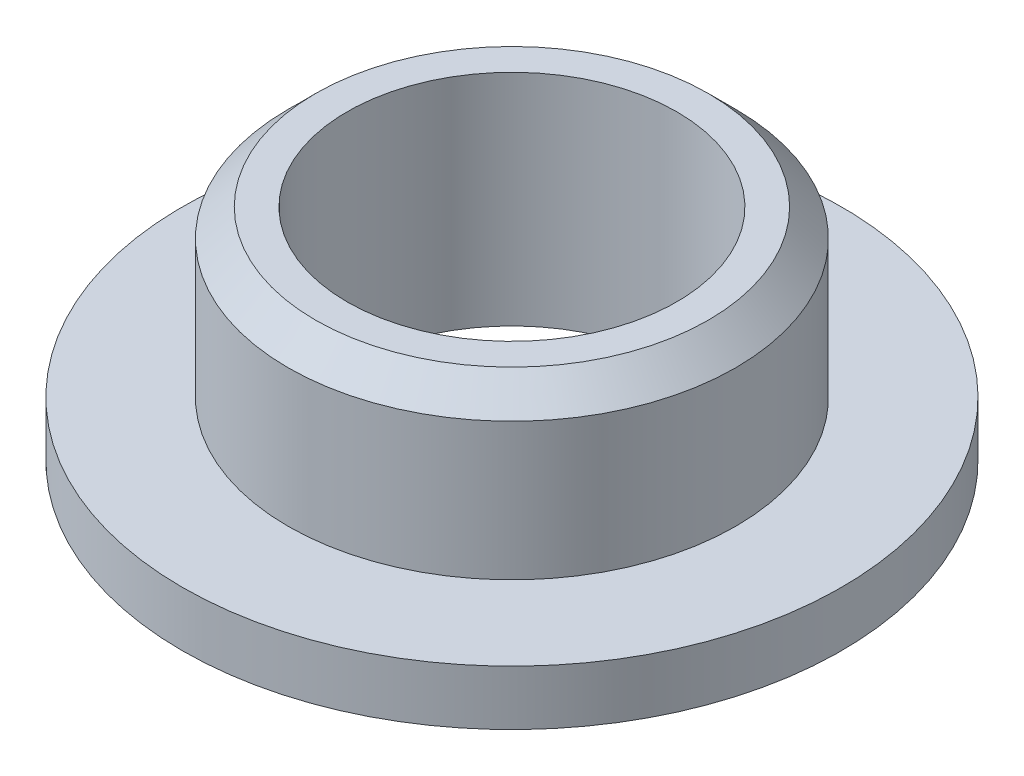
ISO-10303-21;
HEADER;
FILE_DESCRIPTION(('STEP AP214'),'2;1');
FILE_NAME('part.step','',(''),(''),'','','');
FILE_SCHEMA(('AUTOMOTIVE_DESIGN { 1 0 10303 214 1 1 1 1 }'));
ENDSEC;
DATA;
#1=APPLICATION_CONTEXT('core data for automotive mechanical design processes');
#2=APPLICATION_PROTOCOL_DEFINITION('international standard','automotive_design',2000,#1);
#3=PRODUCT_CONTEXT('',#1,'mechanical');
#4=PRODUCT('Part','Part','',(#3));
#5=PRODUCT_RELATED_PRODUCT_CATEGORY('part','',(#4));
#6=PRODUCT_DEFINITION_FORMATION('','',#4);
#7=PRODUCT_DEFINITION_CONTEXT('part definition',#1,'design');
#8=PRODUCT_DEFINITION('design','',#6,#7);
#9=PRODUCT_DEFINITION_SHAPE('','',#8);
#10=(LENGTH_UNIT() NAMED_UNIT(*) SI_UNIT(.MILLI.,.METRE.));
#11=(NAMED_UNIT(*) PLANE_ANGLE_UNIT() SI_UNIT($,.RADIAN.));
#12=(NAMED_UNIT(*) SI_UNIT($,.STERADIAN.) SOLID_ANGLE_UNIT());
#13=UNCERTAINTY_MEASURE_WITH_UNIT(LENGTH_MEASURE(1.E-05),#10,'distance_accuracy_value','');
#14=(GEOMETRIC_REPRESENTATION_CONTEXT(3) GLOBAL_UNCERTAINTY_ASSIGNED_CONTEXT((#13)) GLOBAL_UNIT_ASSIGNED_CONTEXT((#10,
#11,#12)) REPRESENTATION_CONTEXT('',''));
#15=CARTESIAN_POINT('',(0.,0.,0.));
#16=DIRECTION('',(0.,0.,1.));
#17=DIRECTION('',(1.,0.,0.));
#18=AXIS2_PLACEMENT_3D('',#15,#16,#17);
#19=CARTESIAN_POINT('',(-0.13870175421607,1.,-0.180249090615675));
#20=DIRECTION('',(0.,-1.,0.));
#21=DIRECTION('',(0.,0.,-1.));
#22=AXIS2_PLACEMENT_3D('',#19,#20,#21);
#23=CYLINDRICAL_SURFACE('',#22,6.00000000000001);
#24=CARTESIAN_POINT('',(-0.13870175421607,1.,-0.180249090615675));
#25=DIRECTION('',(0.,1.,0.));
#26=DIRECTION('',(0.,0.,1.));
#27=AXIS2_PLACEMENT_3D('',#24,#25,#26);
#28=CIRCLE('',#27,6.00000000000001);
#29=CARTESIAN_POINT('',(-0.13870175421607,1.,5.81975090938433));
#30=VERTEX_POINT('',#29);
#31=EDGE_CURVE('E53',#30,#30,#28,.T.);
#32=ORIENTED_EDGE('',*,*,#31,.F.);
#33=EDGE_LOOP('',(#32));
#34=FACE_BOUND('',#33,.T.);
#35=CARTESIAN_POINT('',(-0.13870175421607,0.,-0.180249090615675));
#36=DIRECTION('',(0.,1.,0.));
#37=DIRECTION('',(0.,0.,1.));
#38=AXIS2_PLACEMENT_3D('',#35,#36,#37);
#39=CIRCLE('',#38,6.00000000000001);
#40=CARTESIAN_POINT('',(-0.13870175421607,0.,5.81975090938433));
#41=VERTEX_POINT('',#40);
#42=EDGE_CURVE('E57',#41,#41,#39,.T.);
#43=ORIENTED_EDGE('',*,*,#42,.T.);
#44=EDGE_LOOP('',(#43));
#45=FACE_BOUND('',#44,.T.);
#46=ADVANCED_FACE('F41',(#34,#45),#23,.T.);
#47=CARTESIAN_POINT('',(-0.13870175421607,1.,-0.180249090615675));
#48=DIRECTION('',(0.,1.,0.));
#49=DIRECTION('',(0.,0.,1.));
#50=AXIS2_PLACEMENT_3D('',#47,#48,#49);
#51=PLANE('',#50);
#52=CARTESIAN_POINT('',(-0.13870175421607,1.,-0.180249090615675));
#53=DIRECTION('',(0.,1.,0.));
#54=DIRECTION('',(0.,0.,1.));
#55=AXIS2_PLACEMENT_3D('',#52,#53,#54);
#56=CIRCLE('',#55,4.07499999999999);
#57=CARTESIAN_POINT('',(-0.13870175421607,1.,3.89475090938432));
#58=VERTEX_POINT('',#57);
#59=EDGE_CURVE('E65',#58,#58,#56,.T.);
#60=ORIENTED_EDGE('',*,*,#59,.F.);
#61=EDGE_LOOP('',(#60));
#62=FACE_BOUND('',#61,.T.);
#63=ORIENTED_EDGE('',*,*,#31,.T.);
#64=EDGE_LOOP('',(#63));
#65=FACE_BOUND('',#64,.T.);
#66=ADVANCED_FACE('F86',(#62,#65),#51,.T.);
#67=CARTESIAN_POINT('',(-0.13870175421607,0.,-0.180249090615675));
#68=DIRECTION('',(0.,1.,0.));
#69=DIRECTION('',(0.,0.,1.));
#70=AXIS2_PLACEMENT_3D('',#67,#68,#69);
#71=PLANE('',#70);
#72=CARTESIAN_POINT('',(-0.13870175421607,0.,-0.180249090615675));
#73=DIRECTION('',(0.,1.,0.));
#74=DIRECTION('',(0.,0.,1.));
#75=AXIS2_PLACEMENT_3D('',#72,#73,#74);
#76=CIRCLE('',#75,3.);
#77=CARTESIAN_POINT('',(-0.13870175421607,0.,2.81975090938433));
#78=VERTEX_POINT('',#77);
#79=EDGE_CURVE('E60',#78,#78,#76,.T.);
#80=ORIENTED_EDGE('',*,*,#79,.T.);
#81=EDGE_LOOP('',(#80));
#82=FACE_BOUND('',#81,.T.);
#83=ORIENTED_EDGE('',*,*,#42,.F.);
#84=EDGE_LOOP('',(#83));
#85=FACE_BOUND('',#84,.T.);
#86=ADVANCED_FACE('F78',(#82,#85),#71,.F.);
#87=CARTESIAN_POINT('',(-0.13870175421607,4.,-0.180249090615675));
#88=DIRECTION('',(0.,1.,0.));
#89=DIRECTION('',(0.,0.,1.));
#90=AXIS2_PLACEMENT_3D('',#87,#88,#89);
#91=PLANE('',#90);
#92=CARTESIAN_POINT('',(-0.13870175421607,4.,-0.180249090615675));
#93=DIRECTION('',(0.,1.,0.));
#94=DIRECTION('',(0.,0.,1.));
#95=AXIS2_PLACEMENT_3D('',#92,#93,#94);
#96=CIRCLE('',#95,3.57499999999999);
#97=CARTESIAN_POINT('',(-0.13870175421607,4.,3.39475090938432));
#98=VERTEX_POINT('',#97);
#99=EDGE_CURVE('E49',#98,#98,#96,.T.);
#100=ORIENTED_EDGE('',*,*,#99,.T.);
#101=EDGE_LOOP('',(#100));
#102=FACE_BOUND('',#101,.T.);
#103=CARTESIAN_POINT('',(-0.13870175421607,4.,-0.180249090615675));
#104=DIRECTION('',(0.,1.,0.));
#105=DIRECTION('',(0.,0.,1.));
#106=AXIS2_PLACEMENT_3D('',#103,#104,#105);
#107=CIRCLE('',#106,3.);
#108=CARTESIAN_POINT('',(-0.13870175421607,4.,2.81975090938433));
#109=VERTEX_POINT('',#108);
#110=EDGE_CURVE('E63',#109,#109,#107,.T.);
#111=ORIENTED_EDGE('',*,*,#110,.F.);
#112=EDGE_LOOP('',(#111));
#113=FACE_BOUND('',#112,.T.);
#114=ADVANCED_FACE('F75',(#102,#113),#91,.T.);
#115=CARTESIAN_POINT('',(-0.13870175421607,4.,-0.180249090615675));
#116=DIRECTION('',(0.,-1.,0.));
#117=DIRECTION('',(0.,0.,-1.));
#118=AXIS2_PLACEMENT_3D('',#115,#116,#117);
#119=CYLINDRICAL_SURFACE('',#118,4.07499999999999);
#120=CARTESIAN_POINT('',(-0.13870175421607,3.5,-0.180249090615675));
#121=DIRECTION('',(0.,1.,0.));
#122=DIRECTION('',(0.,0.,1.));
#123=AXIS2_PLACEMENT_3D('',#120,#121,#122);
#124=CIRCLE('',#123,4.07499999999999);
#125=CARTESIAN_POINT('',(-0.13870175421607,3.5,3.89475090938432));
#126=VERTEX_POINT('',#125);
#127=EDGE_CURVE('E10',#126,#126,#124,.F.);
#128=ORIENTED_EDGE('',*,*,#127,.T.);
#129=EDGE_LOOP('',(#128));
#130=FACE_BOUND('',#129,.T.);
#131=ORIENTED_EDGE('',*,*,#59,.T.);
#132=EDGE_LOOP('',(#131));
#133=FACE_BOUND('',#132,.T.);
#134=ADVANCED_FACE('F77',(#130,#133),#119,.T.);
#135=CARTESIAN_POINT('',(-0.13870175421607,4.,-0.180249090615675));
#136=DIRECTION('',(0.,-1.,0.));
#137=DIRECTION('',(0.,0.,-1.));
#138=AXIS2_PLACEMENT_3D('',#135,#136,#137);
#139=CYLINDRICAL_SURFACE('',#138,3.);
#140=ORIENTED_EDGE('',*,*,#110,.T.);
#141=EDGE_LOOP('',(#140));
#142=FACE_BOUND('',#141,.T.);
#143=ORIENTED_EDGE('',*,*,#79,.F.);
#144=EDGE_LOOP('',(#143));
#145=FACE_BOUND('',#144,.T.);
#146=ADVANCED_FACE('F72',(#142,#145),#139,.F.);
#147=CARTESIAN_POINT('',(-0.13870175421607,4.,-0.180249090615675));
#148=DIRECTION('',(0.,-1.,0.));
#149=DIRECTION('',(0.,0.,-1.));
#150=AXIS2_PLACEMENT_3D('',#147,#148,#149);
#151=CONICAL_SURFACE('',#150,3.57499999999999,0.78539816339745);
#152=ORIENTED_EDGE('',*,*,#127,.F.);
#153=EDGE_LOOP('',(#152));
#154=FACE_BOUND('',#153,.T.);
#155=ORIENTED_EDGE('',*,*,#99,.F.);
#156=EDGE_LOOP('',(#155));
#157=FACE_BOUND('',#156,.T.);
#158=ADVANCED_FACE('F44',(#154,#157),#151,.T.);
#159=CLOSED_SHELL('',(#46,#66,#86,#114,#134,#146,#158));
#160=MANIFOLD_SOLID_BREP('B2',#159);
#161=ADVANCED_BREP_SHAPE_REPRESENTATION('',(#18,#160),#14);
#162=SHAPE_DEFINITION_REPRESENTATION(#9,#161);
ENDSEC;
END-ISO-10303-21;
